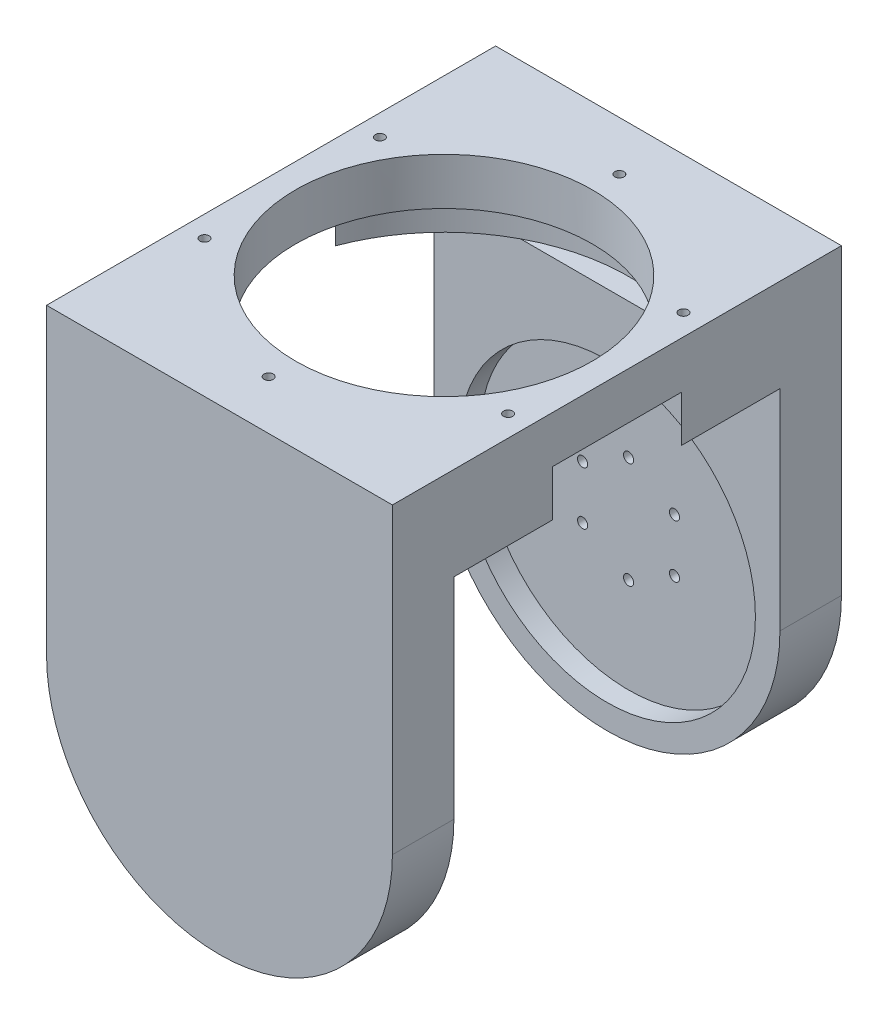
ISO-10303-21;
HEADER;
FILE_DESCRIPTION(('STEP AP214'),'2;1');
FILE_NAME('part.step','',(''),(''),'','','');
FILE_SCHEMA(('AUTOMOTIVE_DESIGN { 1 0 10303 214 1 1 1 1 }'));
ENDSEC;
DATA;
#1=APPLICATION_CONTEXT('core data for automotive mechanical design processes');
#2=APPLICATION_PROTOCOL_DEFINITION('international standard','automotive_design',2000,#1);
#3=PRODUCT_CONTEXT('',#1,'mechanical');
#4=PRODUCT('Part','Part','',(#3));
#5=PRODUCT_RELATED_PRODUCT_CATEGORY('part','',(#4));
#6=PRODUCT_DEFINITION_FORMATION('','',#4);
#7=PRODUCT_DEFINITION_CONTEXT('part definition',#1,'design');
#8=PRODUCT_DEFINITION('design','',#6,#7);
#9=PRODUCT_DEFINITION_SHAPE('','',#8);
#10=(LENGTH_UNIT() NAMED_UNIT(*) SI_UNIT(.MILLI.,.METRE.));
#11=(NAMED_UNIT(*) PLANE_ANGLE_UNIT() SI_UNIT($,.RADIAN.));
#12=(NAMED_UNIT(*) SI_UNIT($,.STERADIAN.) SOLID_ANGLE_UNIT());
#13=UNCERTAINTY_MEASURE_WITH_UNIT(LENGTH_MEASURE(1.E-05),#10,'distance_accuracy_value','');
#14=(GEOMETRIC_REPRESENTATION_CONTEXT(3) GLOBAL_UNCERTAINTY_ASSIGNED_CONTEXT((#13)) GLOBAL_UNIT_ASSIGNED_CONTEXT((#10,
#11,#12)) REPRESENTATION_CONTEXT('',''));
#15=CARTESIAN_POINT('',(0.,0.,0.));
#16=DIRECTION('',(0.,0.,1.));
#17=DIRECTION('',(1.,0.,0.));
#18=AXIS2_PLACEMENT_3D('',#15,#16,#17);
#19=CARTESIAN_POINT('',(0.,16.7418138891637,53.));
#20=DIRECTION('',(0.,1.,0.));
#21=DIRECTION('',(0.,0.,1.));
#22=AXIS2_PLACEMENT_3D('',#19,#20,#21);
#23=CYLINDRICAL_SURFACE('',#22,48.25);
#24=CARTESIAN_POINT('',(0.,61.7418138891637,53.));
#25=DIRECTION('',(0.,1.,0.));
#26=DIRECTION('',(0.,0.,1.));
#27=AXIS2_PLACEMENT_3D('',#24,#25,#26);
#28=CIRCLE('',#27,48.25);
#29=CARTESIAN_POINT('',(0.,61.7418138891637,101.25));
#30=VERTEX_POINT('',#29);
#31=EDGE_CURVE('E200',#30,#30,#28,.F.);
#32=ORIENTED_EDGE('',*,*,#31,.F.);
#33=EDGE_LOOP('',(#32));
#34=FACE_BOUND('',#33,.T.);
#35=CARTESIAN_POINT('',(0.,46.493769150616,53.));
#36=DIRECTION('',(0.,-1.,0.));
#37=DIRECTION('',(0.,0.,-1.));
#38=AXIS2_PLACEMENT_3D('',#35,#36,#37);
#39=CIRCLE('',#38,48.25);
#40=CARTESIAN_POINT('',(0.,46.493769150616,4.75));
#41=VERTEX_POINT('',#40);
#42=EDGE_CURVE('E71',#41,#41,#39,.F.);
#43=ORIENTED_EDGE('',*,*,#42,.F.);
#44=EDGE_LOOP('',(#43));
#45=FACE_BOUND('',#44,.T.);
#46=ADVANCED_FACE('F67',(#34,#45),#23,.F.);
#47=CARTESIAN_POINT('',(56.2228913057406,31.493769150616,0.));
#48=DIRECTION('',(0.,1.,0.));
#49=DIRECTION('',(0.,0.,1.));
#50=AXIS2_PLACEMENT_3D('',#47,#48,#49);
#51=PLANE('',#50);
#52=DIRECTION('',(-1.,0.,0.));
#53=VECTOR('',#52,1.);
#54=CARTESIAN_POINT('',(56.2228913057406,31.493769150616,106.));
#55=LINE('',#54,#53);
#56=CARTESIAN_POINT('',(56.2228913057406,31.493769150616,106.));
#57=VERTEX_POINT('',#56);
#58=CARTESIAN_POINT('',(28.1247222208504,31.493769150616,106.));
#59=VERTEX_POINT('',#58);
#60=EDGE_CURVE('E241',#57,#59,#55,.T.);
#61=ORIENTED_EDGE('',*,*,#60,.T.);
#62=CARTESIAN_POINT('',(0.,31.493769150616,53.));
#63=DIRECTION('',(0.,1.,0.));
#64=DIRECTION('',(0.,0.,1.));
#65=AXIS2_PLACEMENT_3D('',#62,#63,#64);
#66=CIRCLE('',#65,60.);
#67=CARTESIAN_POINT('',(56.2228913057406,31.493769150616,73.9520045156275));
#68=VERTEX_POINT('',#67);
#69=EDGE_CURVE('E12',#59,#68,#66,.T.);
#70=ORIENTED_EDGE('',*,*,#69,.T.);
#71=DIRECTION('',(0.,0.,-1.));
#72=VECTOR('',#71,1.);
#73=CARTESIAN_POINT('',(56.2228913057406,31.493769150616,0.));
#74=LINE('',#73,#72);
#75=EDGE_CURVE('E225',#57,#68,#74,.T.);
#76=ORIENTED_EDGE('',*,*,#75,.F.);
#77=EDGE_LOOP('',(#61,#70,#76));
#78=FACE_BOUND('',#77,.T.);
#79=ADVANCED_FACE('F447',(#78),#51,.F.);
#80=CARTESIAN_POINT('',(56.2228913057406,31.493769150616,32.0479954843725));
#81=VERTEX_POINT('',#80);
#82=CARTESIAN_POINT('',(56.2228913057406,31.493769150616,0.));
#83=VERTEX_POINT('',#82);
#84=EDGE_CURVE('E229',#81,#83,#74,.T.);
#85=ORIENTED_EDGE('',*,*,#84,.F.);
#86=CARTESIAN_POINT('',(0.,31.493769150616,53.));
#87=DIRECTION('',(0.,-1.,0.));
#88=DIRECTION('',(0.,0.,-1.));
#89=AXIS2_PLACEMENT_3D('',#86,#87,#88);
#90=CIRCLE('',#89,60.);
#91=CARTESIAN_POINT('',(28.1247222208504,31.493769150616,0.));
#92=VERTEX_POINT('',#91);
#93=EDGE_CURVE('E179',#92,#81,#90,.T.);
#94=ORIENTED_EDGE('',*,*,#93,.F.);
#95=DIRECTION('',(-1.,0.,0.));
#96=VECTOR('',#95,1.);
#97=CARTESIAN_POINT('',(56.2228913057406,31.493769150616,0.));
#98=LINE('',#97,#96);
#99=EDGE_CURVE('E234',#83,#92,#98,.T.);
#100=ORIENTED_EDGE('',*,*,#99,.F.);
#101=EDGE_LOOP('',(#85,#94,#100));
#102=FACE_BOUND('',#101,.T.);
#103=ADVANCED_FACE('F403',(#102),#51,.F.);
#104=CARTESIAN_POINT('',(-28.1247222208505,31.493769150616,0.));
#105=VERTEX_POINT('',#104);
#106=CARTESIAN_POINT('',(-56.2228913057406,31.493769150616,0.));
#107=VERTEX_POINT('',#106);
#108=EDGE_CURVE('E240',#105,#107,#98,.T.);
#109=ORIENTED_EDGE('',*,*,#108,.F.);
#110=CARTESIAN_POINT('',(-56.2228913057406,31.493769150616,32.0479954843724));
#111=VERTEX_POINT('',#110);
#112=EDGE_CURVE('E77',#105,#111,#66,.T.);
#113=ORIENTED_EDGE('',*,*,#112,.T.);
#114=DIRECTION('',(0.,0.,-1.));
#115=VECTOR('',#114,1.);
#116=CARTESIAN_POINT('',(-56.2228913057406,31.493769150616,0.));
#117=LINE('',#116,#115);
#118=EDGE_CURVE('E224',#111,#107,#117,.T.);
#119=ORIENTED_EDGE('',*,*,#118,.T.);
#120=EDGE_LOOP('',(#109,#113,#119));
#121=FACE_BOUND('',#120,.T.);
#122=ADVANCED_FACE('F380',(#121),#51,.F.);
#123=CARTESIAN_POINT('',(-14.9389382152826,-45.3668138891632,126.001));
#124=DIRECTION('',(0.,0.,-1.));
#125=DIRECTION('',(-1.,0.,0.));
#126=AXIS2_PLACEMENT_3D('',#123,#124,#125);
#127=CYLINDRICAL_SURFACE('',#126,1.64999999999999);
#128=CARTESIAN_POINT('',(-14.9389382152826,-45.3668138891632,-20.));
#129=DIRECTION('',(0.,0.,-1.));
#130=DIRECTION('',(-1.,0.,0.));
#131=AXIS2_PLACEMENT_3D('',#128,#129,#130);
#132=CIRCLE('',#131,1.64999999999999);
#133=CARTESIAN_POINT('',(-16.5889382152826,-45.3668138891632,-20.));
#134=VERTEX_POINT('',#133);
#135=EDGE_CURVE('E279',#134,#134,#132,.F.);
#136=ORIENTED_EDGE('',*,*,#135,.F.);
#137=EDGE_LOOP('',(#136));
#138=FACE_BOUND('',#137,.T.);
#139=CARTESIAN_POINT('',(-14.9389382152826,-45.3668138891632,-7.00000000000001));
#140=DIRECTION('',(0.,0.,1.));
#141=DIRECTION('',(1.,0.,0.));
#142=AXIS2_PLACEMENT_3D('',#139,#140,#141);
#143=CIRCLE('',#142,1.64999999999999);
#144=CARTESIAN_POINT('',(-13.2889382152826,-45.3668138891632,-7.00000000000001));
#145=VERTEX_POINT('',#144);
#146=EDGE_CURVE('E270',#145,#145,#143,.T.);
#147=ORIENTED_EDGE('',*,*,#146,.T.);
#148=EDGE_LOOP('',(#147));
#149=FACE_BOUND('',#148,.T.);
#150=ADVANCED_FACE('F694',(#138,#149),#127,.F.);
#151=CARTESIAN_POINT('',(-1.34079374929402E-12,-53.9918138891637,126.001));
#152=DIRECTION('',(0.,0.,-1.));
#153=DIRECTION('',(-1.,0.,0.));
#154=AXIS2_PLACEMENT_3D('',#151,#152,#153);
#155=CYLINDRICAL_SURFACE('',#154,1.65);
#156=CARTESIAN_POINT('',(-1.34079374929402E-12,-53.9918138891637,-20.));
#157=DIRECTION('',(0.,0.,-1.));
#158=DIRECTION('',(-1.,0.,0.));
#159=AXIS2_PLACEMENT_3D('',#156,#157,#158);
#160=CIRCLE('',#159,1.65);
#161=CARTESIAN_POINT('',(-1.65000000000134,-53.9918138891637,-20.));
#162=VERTEX_POINT('',#161);
#163=EDGE_CURVE('E275',#162,#162,#160,.F.);
#164=ORIENTED_EDGE('',*,*,#163,.F.);
#165=EDGE_LOOP('',(#164));
#166=FACE_BOUND('',#165,.T.);
#167=CARTESIAN_POINT('',(-1.34079374929402E-12,-53.9918138891637,-7.00000000000001));
#168=DIRECTION('',(0.,0.,1.));
#169=DIRECTION('',(1.,0.,0.));
#170=AXIS2_PLACEMENT_3D('',#167,#168,#169);
#171=CIRCLE('',#170,1.65);
#172=CARTESIAN_POINT('',(1.64999999999866,-53.9918138891637,-7.00000000000001));
#173=VERTEX_POINT('',#172);
#174=EDGE_CURVE('E266',#173,#173,#171,.T.);
#175=ORIENTED_EDGE('',*,*,#174,.T.);
#176=EDGE_LOOP('',(#175));
#177=FACE_BOUND('',#176,.T.);
#178=ADVANCED_FACE('F690',(#166,#177),#155,.F.);
#179=CARTESIAN_POINT('',(14.9389382152805,-45.3668138891642,126.001));
#180=DIRECTION('',(0.,0.,-1.));
#181=DIRECTION('',(-1.,0.,0.));
#182=AXIS2_PLACEMENT_3D('',#179,#180,#181);
#183=CYLINDRICAL_SURFACE('',#182,1.65);
#184=CARTESIAN_POINT('',(14.9389382152805,-45.3668138891642,-20.));
#185=DIRECTION('',(0.,0.,-1.));
#186=DIRECTION('',(-1.,0.,0.));
#187=AXIS2_PLACEMENT_3D('',#184,#185,#186);
#188=CIRCLE('',#187,1.65);
#189=CARTESIAN_POINT('',(13.2889382152806,-45.3668138891642,-20.));
#190=VERTEX_POINT('',#189);
#191=EDGE_CURVE('E280',#190,#190,#188,.F.);
#192=ORIENTED_EDGE('',*,*,#191,.F.);
#193=EDGE_LOOP('',(#192));
#194=FACE_BOUND('',#193,.T.);
#195=CARTESIAN_POINT('',(14.9389382152805,-45.3668138891642,-7.00000000000001));
#196=DIRECTION('',(0.,0.,1.));
#197=DIRECTION('',(1.,0.,0.));
#198=AXIS2_PLACEMENT_3D('',#195,#196,#197);
#199=CIRCLE('',#198,1.65);
#200=CARTESIAN_POINT('',(16.5889382152805,-45.3668138891642,-7.00000000000001));
#201=VERTEX_POINT('',#200);
#202=EDGE_CURVE('E262',#201,#201,#199,.T.);
#203=ORIENTED_EDGE('',*,*,#202,.T.);
#204=EDGE_LOOP('',(#203));
#205=FACE_BOUND('',#204,.T.);
#206=ADVANCED_FACE('F693',(#194,#205),#183,.F.);
#207=CARTESIAN_POINT('',(14.9389382152811,-28.1168138891642,126.001));
#208=DIRECTION('',(0.,0.,-1.));
#209=DIRECTION('',(-1.,0.,0.));
#210=AXIS2_PLACEMENT_3D('',#207,#208,#209);
#211=CYLINDRICAL_SURFACE('',#210,1.65);
#212=CARTESIAN_POINT('',(14.9389382152811,-28.1168138891642,-20.));
#213=DIRECTION('',(0.,0.,-1.));
#214=DIRECTION('',(-1.,0.,0.));
#215=AXIS2_PLACEMENT_3D('',#212,#213,#214);
#216=CIRCLE('',#215,1.65);
#217=CARTESIAN_POINT('',(13.2889382152811,-28.1168138891642,-20.));
#218=VERTEX_POINT('',#217);
#219=EDGE_CURVE('E284',#218,#218,#216,.F.);
#220=ORIENTED_EDGE('',*,*,#219,.F.);
#221=EDGE_LOOP('',(#220));
#222=FACE_BOUND('',#221,.T.);
#223=CARTESIAN_POINT('',(14.9389382152811,-28.1168138891642,-7.00000000000001));
#224=DIRECTION('',(0.,0.,1.));
#225=DIRECTION('',(1.,0.,0.));
#226=AXIS2_PLACEMENT_3D('',#223,#224,#225);
#227=CIRCLE('',#226,1.65);
#228=CARTESIAN_POINT('',(16.5889382152811,-28.1168138891642,-7.00000000000001));
#229=VERTEX_POINT('',#228);
#230=EDGE_CURVE('E258',#229,#229,#227,.T.);
#231=ORIENTED_EDGE('',*,*,#230,.T.);
#232=EDGE_LOOP('',(#231));
#233=FACE_BOUND('',#232,.T.);
#234=ADVANCED_FACE('F698',(#222,#233),#211,.F.);
#235=CARTESIAN_POINT('',(0.,-19.4918138891637,126.001));
#236=DIRECTION('',(0.,0.,-1.));
#237=DIRECTION('',(-1.,0.,0.));
#238=AXIS2_PLACEMENT_3D('',#235,#236,#237);
#239=CYLINDRICAL_SURFACE('',#238,1.65);
#240=CARTESIAN_POINT('',(0.,-19.4918138891637,-20.));
#241=DIRECTION('',(0.,0.,-1.));
#242=DIRECTION('',(-1.,0.,0.));
#243=AXIS2_PLACEMENT_3D('',#240,#241,#242);
#244=CIRCLE('',#243,1.65);
#245=CARTESIAN_POINT('',(-1.65,-19.4918138891637,-20.));
#246=VERTEX_POINT('',#245);
#247=EDGE_CURVE('E288',#246,#246,#244,.F.);
#248=ORIENTED_EDGE('',*,*,#247,.F.);
#249=EDGE_LOOP('',(#248));
#250=FACE_BOUND('',#249,.T.);
#251=CARTESIAN_POINT('',(0.,-19.4918138891637,-7.00000000000001));
#252=DIRECTION('',(0.,0.,1.));
#253=DIRECTION('',(1.,0.,0.));
#254=AXIS2_PLACEMENT_3D('',#251,#252,#253);
#255=CIRCLE('',#254,1.65);
#256=CARTESIAN_POINT('',(1.65,-19.4918138891637,-7.00000000000001));
#257=VERTEX_POINT('',#256);
#258=EDGE_CURVE('E254',#257,#257,#255,.T.);
#259=ORIENTED_EDGE('',*,*,#258,.T.);
#260=EDGE_LOOP('',(#259));
#261=FACE_BOUND('',#260,.T.);
#262=ADVANCED_FACE('F702',(#250,#261),#239,.F.);
#263=CARTESIAN_POINT('',(-14.938938215282,-28.1168138891631,126.001));
#264=DIRECTION('',(0.,0.,-1.));
#265=DIRECTION('',(-1.,0.,0.));
#266=AXIS2_PLACEMENT_3D('',#263,#264,#265);
#267=CYLINDRICAL_SURFACE('',#266,1.65);
#268=CARTESIAN_POINT('',(-14.938938215282,-28.1168138891631,-20.));
#269=DIRECTION('',(0.,0.,-1.));
#270=DIRECTION('',(-1.,0.,0.));
#271=AXIS2_PLACEMENT_3D('',#268,#269,#270);
#272=CIRCLE('',#271,1.65);
#273=CARTESIAN_POINT('',(-16.588938215282,-28.1168138891631,-20.));
#274=VERTEX_POINT('',#273);
#275=EDGE_CURVE('E274',#274,#274,#272,.F.);
#276=ORIENTED_EDGE('',*,*,#275,.F.);
#277=EDGE_LOOP('',(#276));
#278=FACE_BOUND('',#277,.T.);
#279=CARTESIAN_POINT('',(-14.938938215282,-28.1168138891631,-7.00000000000001));
#280=DIRECTION('',(0.,0.,1.));
#281=DIRECTION('',(1.,0.,0.));
#282=AXIS2_PLACEMENT_3D('',#279,#280,#281);
#283=CIRCLE('',#282,1.65);
#284=CARTESIAN_POINT('',(-13.288938215282,-28.1168138891631,-7.00000000000001));
#285=VERTEX_POINT('',#284);
#286=EDGE_CURVE('E250',#285,#285,#283,.T.);
#287=ORIENTED_EDGE('',*,*,#286,.T.);
#288=EDGE_LOOP('',(#287));
#289=FACE_BOUND('',#288,.T.);
#290=ADVANCED_FACE('F706',(#278,#289),#267,.F.);
#291=CARTESIAN_POINT('',(0.,-36.7418138891637,20.));
#292=DIRECTION('',(0.,0.,-1.));
#293=DIRECTION('',(-1.,0.,0.));
#294=AXIS2_PLACEMENT_3D('',#291,#292,#293);
#295=CYLINDRICAL_SURFACE('',#294,56.2228913057406);
#296=CARTESIAN_POINT('',(0.,-36.7418138891637,0.));
#297=DIRECTION('',(0.,0.,1.));
#298=DIRECTION('',(1.,0.,0.));
#299=AXIS2_PLACEMENT_3D('',#296,#297,#298);
#300=CIRCLE('',#299,56.2228913057406);
#301=CARTESIAN_POINT('',(-56.2228913057406,-36.7418138891637,0.));
#302=VERTEX_POINT('',#301);
#303=CARTESIAN_POINT('',(56.2228913057406,-36.7418138891637,0.));
#304=VERTEX_POINT('',#303);
#305=EDGE_CURVE('E313',#302,#304,#300,.T.);
#306=ORIENTED_EDGE('',*,*,#305,.F.);
#307=DIRECTION('',(0.,0.,-1.));
#308=VECTOR('',#307,1.);
#309=CARTESIAN_POINT('',(-56.2228913057406,-36.7418138891637,20.));
#310=LINE('',#309,#308);
#311=CARTESIAN_POINT('',(-56.2228913057406,-36.7418138891637,-20.));
#312=VERTEX_POINT('',#311);
#313=EDGE_CURVE('E357',#302,#312,#310,.T.);
#314=ORIENTED_EDGE('',*,*,#313,.T.);
#315=CARTESIAN_POINT('',(0.,-36.7418138891637,-20.));
#316=DIRECTION('',(0.,0.,-1.));
#317=DIRECTION('',(-1.,0.,0.));
#318=AXIS2_PLACEMENT_3D('',#315,#316,#317);
#319=CIRCLE('',#318,56.2228913057406);
#320=CARTESIAN_POINT('',(56.2228913057406,-36.7418138891637,-20.));
#321=VERTEX_POINT('',#320);
#322=EDGE_CURVE('E320',#321,#312,#319,.T.);
#323=ORIENTED_EDGE('',*,*,#322,.F.);
#324=DIRECTION('',(0.,0.,-1.));
#325=VECTOR('',#324,1.);
#326=CARTESIAN_POINT('',(56.2228913057406,-36.7418138891637,20.));
#327=LINE('',#326,#325);
#328=EDGE_CURVE('E360',#304,#321,#327,.T.);
#329=ORIENTED_EDGE('',*,*,#328,.F.);
#330=EDGE_LOOP('',(#306,#314,#323,#329));
#331=FACE_BOUND('',#330,.T.);
#332=ADVANCED_FACE('F69',(#331),#295,.T.);
#333=CARTESIAN_POINT('',(0.,-36.7418138891637,106.));
#334=DIRECTION('',(0.,0.,-1.));
#335=DIRECTION('',(-1.,0.,0.));
#336=AXIS2_PLACEMENT_3D('',#333,#334,#335);
#337=CYLINDRICAL_SURFACE('',#336,56.2228913057406);
#338=CARTESIAN_POINT('',(0.,-36.7418138891637,106.));
#339=DIRECTION('',(0.,0.,-1.));
#340=DIRECTION('',(-1.,0.,0.));
#341=AXIS2_PLACEMENT_3D('',#338,#339,#340);
#342=CIRCLE('',#341,56.2228913057406);
#343=CARTESIAN_POINT('',(56.2228913057406,-36.7418138891637,106.));
#344=VERTEX_POINT('',#343);
#345=CARTESIAN_POINT('',(-56.2228913057406,-36.7418138891637,106.));
#346=VERTEX_POINT('',#345);
#347=EDGE_CURVE('E334',#344,#346,#342,.T.);
#348=ORIENTED_EDGE('',*,*,#347,.F.);
#349=DIRECTION('',(0.,0.,-1.));
#350=VECTOR('',#349,1.);
#351=CARTESIAN_POINT('',(56.2228913057406,-36.7418138891637,106.));
#352=LINE('',#351,#350);
#353=CARTESIAN_POINT('',(56.2228913057406,-36.7418138891637,126.));
#354=VERTEX_POINT('',#353);
#355=EDGE_CURVE('E353',#354,#344,#352,.T.);
#356=ORIENTED_EDGE('',*,*,#355,.F.);
#357=CARTESIAN_POINT('',(0.,-36.7418138891637,126.));
#358=DIRECTION('',(0.,0.,1.));
#359=DIRECTION('',(1.,0.,0.));
#360=AXIS2_PLACEMENT_3D('',#357,#358,#359);
#361=CIRCLE('',#360,56.2228913057406);
#362=CARTESIAN_POINT('',(-56.2228913057406,-36.7418138891637,126.));
#363=VERTEX_POINT('',#362);
#364=EDGE_CURVE('E341',#363,#354,#361,.T.);
#365=ORIENTED_EDGE('',*,*,#364,.F.);
#366=DIRECTION('',(0.,0.,-1.));
#367=VECTOR('',#366,1.);
#368=CARTESIAN_POINT('',(-56.2228913057406,-36.7418138891637,106.));
#369=LINE('',#368,#367);
#370=EDGE_CURVE('E93',#363,#346,#369,.T.);
#371=ORIENTED_EDGE('',*,*,#370,.T.);
#372=EDGE_LOOP('',(#348,#356,#365,#371));
#373=FACE_BOUND('',#372,.T.);
#374=ADVANCED_FACE('F427',(#373),#337,.T.);
#375=CARTESIAN_POINT('',(56.2228913057406,0.,20.));
#376=DIRECTION('',(-1.,0.,0.));
#377=DIRECTION('',(0.,0.,1.));
#378=AXIS2_PLACEMENT_3D('',#375,#376,#377);
#379=PLANE('',#378);
#380=DIRECTION('',(0.,0.,1.));
#381=VECTOR('',#380,1.);
#382=CARTESIAN_POINT('',(56.2228913057406,46.493769150616,20.));
#383=LINE('',#382,#381);
#384=CARTESIAN_POINT('',(56.2228913057406,46.493769150616,32.0479954843725));
#385=VERTEX_POINT('',#384);
#386=CARTESIAN_POINT('',(56.2228913057406,46.493769150616,73.9520045156275));
#387=VERTEX_POINT('',#386);
#388=EDGE_CURVE('E189',#385,#387,#383,.T.);
#389=ORIENTED_EDGE('',*,*,#388,.F.);
#390=DIRECTION('',(0.,-1.,0.));
#391=VECTOR('',#390,1.);
#392=CARTESIAN_POINT('',(56.2228913057406,46.493769150616,32.0479954843725));
#393=LINE('',#392,#391);
#394=EDGE_CURVE('E172',#385,#81,#393,.T.);
#395=ORIENTED_EDGE('',*,*,#394,.T.);
#396=ORIENTED_EDGE('',*,*,#84,.T.);
#397=DIRECTION('',(0.,1.,0.));
#398=VECTOR('',#397,1.);
#399=CARTESIAN_POINT('',(56.2228913057406,-36.7418138891637,0.));
#400=LINE('',#399,#398);
#401=EDGE_CURVE('E316',#304,#83,#400,.T.);
#402=ORIENTED_EDGE('',*,*,#401,.F.);
#403=ORIENTED_EDGE('',*,*,#328,.T.);
#404=DIRECTION('',(0.,-1.,0.));
#405=VECTOR('',#404,1.);
#406=CARTESIAN_POINT('',(56.2228913057406,36.7418138891637,-20.));
#407=LINE('',#406,#405);
#408=CARTESIAN_POINT('',(56.2228913057406,61.7418138891637,-20.));
#409=VERTEX_POINT('',#408);
#410=EDGE_CURVE('E327',#409,#321,#407,.T.);
#411=ORIENTED_EDGE('',*,*,#410,.F.);
#412=DIRECTION('',(0.,0.,-1.));
#413=VECTOR('',#412,1.);
#414=CARTESIAN_POINT('',(56.2228913057406,61.7418138891637,126.));
#415=LINE('',#414,#413);
#416=CARTESIAN_POINT('',(56.2228913057406,61.7418138891637,126.));
#417=VERTEX_POINT('',#416);
#418=EDGE_CURVE('E212',#417,#409,#415,.T.);
#419=ORIENTED_EDGE('',*,*,#418,.F.);
#420=DIRECTION('',(0.,1.,0.));
#421=VECTOR('',#420,1.);
#422=CARTESIAN_POINT('',(56.2228913057406,-36.7418138891637,126.));
#423=LINE('',#422,#421);
#424=EDGE_CURVE('E345',#354,#417,#423,.T.);
#425=ORIENTED_EDGE('',*,*,#424,.F.);
#426=ORIENTED_EDGE('',*,*,#355,.T.);
#427=DIRECTION('',(0.,-1.,0.));
#428=VECTOR('',#427,1.);
#429=CARTESIAN_POINT('',(56.2228913057406,6.49376915061593,106.));
#430=LINE('',#429,#428);
#431=EDGE_CURVE('E331',#57,#344,#430,.T.);
#432=ORIENTED_EDGE('',*,*,#431,.F.);
#433=ORIENTED_EDGE('',*,*,#75,.T.);
#434=DIRECTION('',(0.,-1.,0.));
#435=VECTOR('',#434,1.);
#436=CARTESIAN_POINT('',(56.2228913057406,46.493769150616,73.9520045156275));
#437=LINE('',#436,#435);
#438=EDGE_CURVE('E184',#68,#387,#437,.F.);
#439=ORIENTED_EDGE('',*,*,#438,.T.);
#440=EDGE_LOOP('',(#389,#395,#396,#402,#403,#411,#419,#425,#426,#432,#433,#439));
#441=FACE_BOUND('',#440,.T.);
#442=ADVANCED_FACE('F197',(#441),#379,.F.);
#443=CARTESIAN_POINT('',(-56.2228913057406,0.,20.));
#444=DIRECTION('',(-1.,0.,0.));
#445=DIRECTION('',(0.,0.,1.));
#446=AXIS2_PLACEMENT_3D('',#443,#444,#445);
#447=PLANE('',#446);
#448=DIRECTION('',(0.,-1.,0.));
#449=VECTOR('',#448,1.);
#450=CARTESIAN_POINT('',(-56.2228913057406,46.493769150616,32.0479954843724));
#451=LINE('',#450,#449);
#452=CARTESIAN_POINT('',(-56.2228913057406,46.493769150616,32.0479954843724));
#453=VERTEX_POINT('',#452);
#454=EDGE_CURVE('E384',#453,#111,#451,.T.);
#455=ORIENTED_EDGE('',*,*,#454,.F.);
#456=DIRECTION('',(0.,0.,1.));
#457=VECTOR('',#456,1.);
#458=CARTESIAN_POINT('',(-56.2228913057406,46.493769150616,20.));
#459=LINE('',#458,#457);
#460=CARTESIAN_POINT('',(-56.2228913057406,46.493769150616,73.9520045156276));
#461=VERTEX_POINT('',#460);
#462=EDGE_CURVE('E192',#453,#461,#459,.T.);
#463=ORIENTED_EDGE('',*,*,#462,.T.);
#464=DIRECTION('',(0.,-1.,0.));
#465=VECTOR('',#464,1.);
#466=CARTESIAN_POINT('',(-56.2228913057406,46.493769150616,73.9520045156276));
#467=LINE('',#466,#465);
#468=CARTESIAN_POINT('',(-56.2228913057406,31.493769150616,73.9520045156276));
#469=VERTEX_POINT('',#468);
#470=EDGE_CURVE('E408',#469,#461,#467,.F.);
#471=ORIENTED_EDGE('',*,*,#470,.F.);
#472=CARTESIAN_POINT('',(-56.2228913057406,31.493769150616,106.));
#473=VERTEX_POINT('',#472);
#474=EDGE_CURVE('E230',#473,#469,#117,.T.);
#475=ORIENTED_EDGE('',*,*,#474,.F.);
#476=DIRECTION('',(0.,1.,0.));
#477=VECTOR('',#476,1.);
#478=CARTESIAN_POINT('',(-56.2228913057406,-36.7418138891637,106.));
#479=LINE('',#478,#477);
#480=EDGE_CURVE('E337',#346,#473,#479,.T.);
#481=ORIENTED_EDGE('',*,*,#480,.F.);
#482=ORIENTED_EDGE('',*,*,#370,.F.);
#483=DIRECTION('',(0.,-1.,0.));
#484=VECTOR('',#483,1.);
#485=CARTESIAN_POINT('',(-56.2228913057406,36.7418138891637,126.));
#486=LINE('',#485,#484);
#487=CARTESIAN_POINT('',(-56.2228913057406,61.7418138891637,126.));
#488=VERTEX_POINT('',#487);
#489=EDGE_CURVE('E348',#488,#363,#486,.T.);
#490=ORIENTED_EDGE('',*,*,#489,.F.);
#491=DIRECTION('',(0.,0.,1.));
#492=VECTOR('',#491,1.);
#493=CARTESIAN_POINT('',(-56.2228913057406,61.7418138891637,-20.));
#494=LINE('',#493,#492);
#495=CARTESIAN_POINT('',(-56.2228913057406,61.7418138891637,-20.));
#496=VERTEX_POINT('',#495);
#497=EDGE_CURVE('E220',#496,#488,#494,.T.);
#498=ORIENTED_EDGE('',*,*,#497,.F.);
#499=DIRECTION('',(0.,1.,0.));
#500=VECTOR('',#499,1.);
#501=CARTESIAN_POINT('',(-56.2228913057406,-36.7418138891637,-20.));
#502=LINE('',#501,#500);
#503=EDGE_CURVE('E324',#312,#496,#502,.T.);
#504=ORIENTED_EDGE('',*,*,#503,.F.);
#505=ORIENTED_EDGE('',*,*,#313,.F.);
#506=DIRECTION('',(0.,-1.,0.));
#507=VECTOR('',#506,1.);
#508=CARTESIAN_POINT('',(-56.2228913057406,6.49376915061594,0.));
#509=LINE('',#508,#507);
#510=EDGE_CURVE('E307',#107,#302,#509,.T.);
#511=ORIENTED_EDGE('',*,*,#510,.F.);
#512=ORIENTED_EDGE('',*,*,#118,.F.);
#513=EDGE_LOOP('',(#455,#463,#471,#475,#481,#482,#490,#498,#504,#505,#511,#512));
#514=FACE_BOUND('',#513,.T.);
#515=ADVANCED_FACE('F383',(#514),#447,.T.);
#516=CARTESIAN_POINT('',(0.,-36.7418138891637,126.));
#517=DIRECTION('',(0.,0.,1.));
#518=DIRECTION('',(1.,0.,0.));
#519=AXIS2_PLACEMENT_3D('',#516,#517,#518);
#520=PLANE('',#519);
#521=ORIENTED_EDGE('',*,*,#364,.T.);
#522=ORIENTED_EDGE('',*,*,#424,.T.);
#523=DIRECTION('',(1.,0.,0.));
#524=VECTOR('',#523,1.);
#525=CARTESIAN_POINT('',(-56.2228913057406,61.7418138891637,126.));
#526=LINE('',#525,#524);
#527=EDGE_CURVE('E205',#488,#417,#526,.T.);
#528=ORIENTED_EDGE('',*,*,#527,.F.);
#529=ORIENTED_EDGE('',*,*,#489,.T.);
#530=EDGE_LOOP('',(#521,#522,#528,#529));
#531=FACE_BOUND('',#530,.T.);
#532=ADVANCED_FACE('F430',(#531),#520,.T.);
#533=CARTESIAN_POINT('',(0.,-36.7418138891637,106.));
#534=DIRECTION('',(0.,0.,-1.));
#535=DIRECTION('',(-1.,0.,0.));
#536=AXIS2_PLACEMENT_3D('',#533,#534,#535);
#537=PLANE('',#536);
#538=ORIENTED_EDGE('',*,*,#60,.F.);
#539=ORIENTED_EDGE('',*,*,#431,.T.);
#540=ORIENTED_EDGE('',*,*,#347,.T.);
#541=ORIENTED_EDGE('',*,*,#480,.T.);
#542=CARTESIAN_POINT('',(-28.1247222208505,31.493769150616,106.));
#543=VERTEX_POINT('',#542);
#544=EDGE_CURVE('E228',#543,#473,#55,.T.);
#545=ORIENTED_EDGE('',*,*,#544,.F.);
#546=EDGE_CURVE('E245',#59,#543,#55,.T.);
#547=ORIENTED_EDGE('',*,*,#546,.F.);
#548=EDGE_LOOP('',(#538,#539,#540,#541,#545,#547));
#549=FACE_BOUND('',#548,.T.);
#550=CARTESIAN_POINT('',(0.,-36.7418138891637,106.));
#551=DIRECTION('',(0.,0.,-1.));
#552=DIRECTION('',(-1.,0.,0.));
#553=AXIS2_PLACEMENT_3D('',#550,#551,#552);
#554=CIRCLE('',#553,27.5);
#555=CARTESIAN_POINT('',(-27.5,-36.7418138891637,106.));
#556=VERTEX_POINT('',#555);
#557=EDGE_CURVE('E302',#556,#556,#554,.T.);
#558=ORIENTED_EDGE('',*,*,#557,.F.);
#559=EDGE_LOOP('',(#558));
#560=FACE_BOUND('',#559,.T.);
#561=ADVANCED_FACE('F422',(#549,#560),#537,.T.);
#562=CARTESIAN_POINT('',(0.,-36.7418138891637,-20.));
#563=DIRECTION('',(0.,0.,-1.));
#564=DIRECTION('',(-1.,0.,0.));
#565=AXIS2_PLACEMENT_3D('',#562,#563,#564);
#566=PLANE('',#565);
#567=ORIENTED_EDGE('',*,*,#275,.T.);
#568=EDGE_LOOP('',(#567));
#569=FACE_BOUND('',#568,.T.);
#570=ORIENTED_EDGE('',*,*,#247,.T.);
#571=EDGE_LOOP('',(#570));
#572=FACE_BOUND('',#571,.T.);
#573=ORIENTED_EDGE('',*,*,#219,.T.);
#574=EDGE_LOOP('',(#573));
#575=FACE_BOUND('',#574,.T.);
#576=ORIENTED_EDGE('',*,*,#191,.T.);
#577=EDGE_LOOP('',(#576));
#578=FACE_BOUND('',#577,.T.);
#579=ORIENTED_EDGE('',*,*,#163,.T.);
#580=EDGE_LOOP('',(#579));
#581=FACE_BOUND('',#580,.T.);
#582=ORIENTED_EDGE('',*,*,#135,.T.);
#583=EDGE_LOOP('',(#582));
#584=FACE_BOUND('',#583,.T.);
#585=ORIENTED_EDGE('',*,*,#322,.T.);
#586=ORIENTED_EDGE('',*,*,#503,.T.);
#587=DIRECTION('',(-1.,0.,0.));
#588=VECTOR('',#587,1.);
#589=CARTESIAN_POINT('',(56.2228913057406,61.7418138891637,-20.));
#590=LINE('',#589,#588);
#591=EDGE_CURVE('E216',#409,#496,#590,.T.);
#592=ORIENTED_EDGE('',*,*,#591,.F.);
#593=ORIENTED_EDGE('',*,*,#410,.T.);
#594=EDGE_LOOP('',(#585,#586,#592,#593));
#595=FACE_BOUND('',#594,.T.);
#596=ADVANCED_FACE('F439',(#569,#572,#575,#578,#581,#584,#595),#566,.T.);
#597=CARTESIAN_POINT('',(0.,-36.7418138891637,0.));
#598=DIRECTION('',(0.,0.,1.));
#599=DIRECTION('',(1.,0.,0.));
#600=AXIS2_PLACEMENT_3D('',#597,#598,#599);
#601=PLANE('',#600);
#602=ORIENTED_EDGE('',*,*,#99,.T.);
#603=EDGE_CURVE('E239',#92,#105,#98,.T.);
#604=ORIENTED_EDGE('',*,*,#603,.T.);
#605=ORIENTED_EDGE('',*,*,#108,.T.);
#606=ORIENTED_EDGE('',*,*,#510,.T.);
#607=ORIENTED_EDGE('',*,*,#305,.T.);
#608=ORIENTED_EDGE('',*,*,#401,.T.);
#609=EDGE_LOOP('',(#602,#604,#605,#606,#607,#608));
#610=FACE_BOUND('',#609,.T.);
#611=CARTESIAN_POINT('',(0.,-36.7418138891637,0.));
#612=DIRECTION('',(0.,0.,1.));
#613=DIRECTION('',(1.,0.,0.));
#614=AXIS2_PLACEMENT_3D('',#611,#612,#613);
#615=CIRCLE('',#614,48.25);
#616=CARTESIAN_POINT('',(48.25,-36.7418138891637,0.));
#617=VERTEX_POINT('',#616);
#618=EDGE_CURVE('E238',#617,#617,#615,.T.);
#619=ORIENTED_EDGE('',*,*,#618,.F.);
#620=EDGE_LOOP('',(#619));
#621=FACE_BOUND('',#620,.T.);
#622=ADVANCED_FACE('F393',(#610,#621),#601,.T.);
#623=CARTESIAN_POINT('',(0.,-36.7418138891637,86.));
#624=DIRECTION('',(0.,0.,-1.));
#625=DIRECTION('',(-1.,0.,0.));
#626=AXIS2_PLACEMENT_3D('',#623,#624,#625);
#627=PLANE('',#626);
#628=CARTESIAN_POINT('',(0.,-36.7418138891637,86.));
#629=DIRECTION('',(0.,0.,-1.));
#630=DIRECTION('',(-1.,0.,0.));
#631=AXIS2_PLACEMENT_3D('',#628,#629,#630);
#632=CIRCLE('',#631,27.5);
#633=CARTESIAN_POINT('',(-27.5,-36.7418138891637,86.));
#634=VERTEX_POINT('',#633);
#635=EDGE_CURVE('E303',#634,#634,#632,.T.);
#636=ORIENTED_EDGE('',*,*,#635,.T.);
#637=EDGE_LOOP('',(#636));
#638=FACE_BOUND('',#637,.T.);
#639=CARTESIAN_POINT('',(0.,-36.7418138891637,86.));
#640=DIRECTION('',(0.,0.,-1.));
#641=DIRECTION('',(-1.,0.,0.));
#642=AXIS2_PLACEMENT_3D('',#639,#640,#641);
#643=CIRCLE('',#642,13.1040746271291);
#644=CARTESIAN_POINT('',(-13.1040746271291,-36.7418138891637,86.));
#645=VERTEX_POINT('',#644);
#646=EDGE_CURVE('E298',#645,#645,#643,.T.);
#647=ORIENTED_EDGE('',*,*,#646,.F.);
#648=EDGE_LOOP('',(#647));
#649=FACE_BOUND('',#648,.T.);
#650=ADVANCED_FACE('F504',(#638,#649),#627,.T.);
#651=CARTESIAN_POINT('',(0.,-36.7418138891637,86.));
#652=DIRECTION('',(0.,0.,1.));
#653=DIRECTION('',(1.,0.,0.));
#654=AXIS2_PLACEMENT_3D('',#651,#652,#653);
#655=CYLINDRICAL_SURFACE('',#654,27.5);
#656=ORIENTED_EDGE('',*,*,#635,.F.);
#657=EDGE_LOOP('',(#656));
#658=FACE_BOUND('',#657,.T.);
#659=ORIENTED_EDGE('',*,*,#557,.T.);
#660=EDGE_LOOP('',(#659));
#661=FACE_BOUND('',#660,.T.);
#662=ADVANCED_FACE('F717',(#658,#661),#655,.T.);
#663=CARTESIAN_POINT('',(0.,-36.7418138891637,86.));
#664=DIRECTION('',(0.,0.,1.));
#665=DIRECTION('',(1.,0.,0.));
#666=AXIS2_PLACEMENT_3D('',#663,#664,#665);
#667=CYLINDRICAL_SURFACE('',#666,13.1040746271291);
#668=ORIENTED_EDGE('',*,*,#646,.T.);
#669=EDGE_LOOP('',(#668));
#670=FACE_BOUND('',#669,.T.);
#671=CARTESIAN_POINT('',(0.,-36.7418138891637,106.));
#672=DIRECTION('',(0.,0.,-1.));
#673=DIRECTION('',(-1.,0.,0.));
#674=AXIS2_PLACEMENT_3D('',#671,#672,#673);
#675=CIRCLE('',#674,13.1040746271291);
#676=CARTESIAN_POINT('',(-13.1040746271291,-36.7418138891637,106.));
#677=VERTEX_POINT('',#676);
#678=EDGE_CURVE('E363',#677,#677,#675,.F.);
#679=ORIENTED_EDGE('',*,*,#678,.T.);
#680=EDGE_LOOP('',(#679));
#681=FACE_BOUND('',#680,.T.);
#682=ADVANCED_FACE('F714',(#670,#681),#667,.F.);
#683=ORIENTED_EDGE('',*,*,#678,.F.);
#684=EDGE_LOOP('',(#683));
#685=FACE_BOUND('',#684,.T.);
#686=ADVANCED_FACE('F496',(#685),#537,.T.);
#687=CARTESIAN_POINT('',(0.,-36.7418138891637,-7.));
#688=DIRECTION('',(0.,0.,1.));
#689=DIRECTION('',(1.,0.,0.));
#690=AXIS2_PLACEMENT_3D('',#687,#688,#689);
#691=CYLINDRICAL_SURFACE('',#690,48.25);
#692=CARTESIAN_POINT('',(0.,-36.7418138891637,-7.));
#693=DIRECTION('',(0.,0.,1.));
#694=DIRECTION('',(1.,0.,0.));
#695=AXIS2_PLACEMENT_3D('',#692,#693,#694);
#696=CIRCLE('',#695,48.25);
#697=CARTESIAN_POINT('',(48.25,-36.7418138891637,-7.));
#698=VERTEX_POINT('',#697);
#699=EDGE_CURVE('E246',#698,#698,#696,.T.);
#700=ORIENTED_EDGE('',*,*,#699,.F.);
#701=EDGE_LOOP('',(#700));
#702=FACE_BOUND('',#701,.T.);
#703=ORIENTED_EDGE('',*,*,#618,.T.);
#704=EDGE_LOOP('',(#703));
#705=FACE_BOUND('',#704,.T.);
#706=ADVANCED_FACE('F685',(#702,#705),#691,.F.);
#707=CARTESIAN_POINT('',(0.,-36.7418138891637,-7.));
#708=DIRECTION('',(0.,0.,1.));
#709=DIRECTION('',(1.,0.,0.));
#710=AXIS2_PLACEMENT_3D('',#707,#708,#709);
#711=PLANE('',#710);
#712=ORIENTED_EDGE('',*,*,#146,.F.);
#713=EDGE_LOOP('',(#712));
#714=FACE_BOUND('',#713,.T.);
#715=ORIENTED_EDGE('',*,*,#174,.F.);
#716=EDGE_LOOP('',(#715));
#717=FACE_BOUND('',#716,.T.);
#718=ORIENTED_EDGE('',*,*,#202,.F.);
#719=EDGE_LOOP('',(#718));
#720=FACE_BOUND('',#719,.T.);
#721=ORIENTED_EDGE('',*,*,#230,.F.);
#722=EDGE_LOOP('',(#721));
#723=FACE_BOUND('',#722,.T.);
#724=ORIENTED_EDGE('',*,*,#258,.F.);
#725=EDGE_LOOP('',(#724));
#726=FACE_BOUND('',#725,.T.);
#727=ORIENTED_EDGE('',*,*,#286,.F.);
#728=EDGE_LOOP('',(#727));
#729=FACE_BOUND('',#728,.T.);
#730=ORIENTED_EDGE('',*,*,#699,.T.);
#731=EDGE_LOOP('',(#730));
#732=FACE_BOUND('',#731,.T.);
#733=ADVANCED_FACE('F510',(#714,#717,#720,#723,#726,#729,#732),#711,.T.);
#734=ORIENTED_EDGE('',*,*,#474,.T.);
#735=EDGE_CURVE('E78',#469,#543,#66,.T.);
#736=ORIENTED_EDGE('',*,*,#735,.T.);
#737=ORIENTED_EDGE('',*,*,#544,.T.);
#738=EDGE_LOOP('',(#734,#736,#737));
#739=FACE_BOUND('',#738,.T.);
#740=ADVANCED_FACE('F418',(#739),#51,.F.);
#741=CARTESIAN_POINT('',(0.,61.7418138891637,0.));
#742=DIRECTION('',(0.,1.,0.));
#743=DIRECTION('',(0.,0.,1.));
#744=AXIS2_PLACEMENT_3D('',#741,#742,#743);
#745=PLANE('',#744);
#746=CARTESIAN_POINT('',(0.,61.7418138891638,110.));
#747=DIRECTION('',(0.,-1.,0.));
#748=DIRECTION('',(0.,0.,-1.));
#749=AXIS2_PLACEMENT_3D('',#746,#747,#748);
#750=CIRCLE('',#749,1.5);
#751=CARTESIAN_POINT('',(0.,61.7418138891638,108.5));
#752=VERTEX_POINT('',#751);
#753=EDGE_CURVE('E400',#752,#752,#750,.T.);
#754=ORIENTED_EDGE('',*,*,#753,.T.);
#755=EDGE_LOOP('',(#754));
#756=FACE_BOUND('',#755,.T.);
#757=CARTESIAN_POINT('',(-49.3634480157115,61.7418138891638,81.4999999999985));
#758=DIRECTION('',(0.,-1.,0.));
#759=DIRECTION('',(0.,0.,-1.));
#760=AXIS2_PLACEMENT_3D('',#757,#758,#759);
#761=CIRCLE('',#760,1.50000000000001);
#762=CARTESIAN_POINT('',(-49.3634480157115,61.7418138891638,79.9999999999985));
#763=VERTEX_POINT('',#762);
#764=EDGE_CURVE('E640',#763,#763,#761,.T.);
#765=ORIENTED_EDGE('',*,*,#764,.T.);
#766=EDGE_LOOP('',(#765));
#767=FACE_BOUND('',#766,.T.);
#768=CARTESIAN_POINT('',(-49.3634480157097,61.7418138891638,24.4999999999984));
#769=DIRECTION('',(0.,-1.,0.));
#770=DIRECTION('',(0.,0.,-1.));
#771=AXIS2_PLACEMENT_3D('',#768,#769,#770);
#772=CIRCLE('',#771,1.5);
#773=CARTESIAN_POINT('',(-49.3634480157097,61.7418138891638,22.9999999999984));
#774=VERTEX_POINT('',#773);
#775=EDGE_CURVE('E656',#774,#774,#772,.T.);
#776=ORIENTED_EDGE('',*,*,#775,.T.);
#777=EDGE_LOOP('',(#776));
#778=FACE_BOUND('',#777,.T.);
#779=CARTESIAN_POINT('',(4.4202837051426E-12,61.7418138891638,-4.));
#780=DIRECTION('',(0.,-1.,0.));
#781=DIRECTION('',(0.,0.,-1.));
#782=AXIS2_PLACEMENT_3D('',#779,#780,#781);
#783=CIRCLE('',#782,1.5);
#784=CARTESIAN_POINT('',(4.4202837051426E-12,61.7418138891638,-5.5));
#785=VERTEX_POINT('',#784);
#786=EDGE_CURVE('E651',#785,#785,#783,.T.);
#787=ORIENTED_EDGE('',*,*,#786,.T.);
#788=EDGE_LOOP('',(#787));
#789=FACE_BOUND('',#788,.T.);
#790=CARTESIAN_POINT('',(49.3634480157165,61.7418138891638,24.5000000000019));
#791=DIRECTION('',(0.,-1.,0.));
#792=DIRECTION('',(0.,0.,-1.));
#793=AXIS2_PLACEMENT_3D('',#790,#791,#792);
#794=CIRCLE('',#793,1.5);
#795=CARTESIAN_POINT('',(49.3634480157165,61.7418138891638,23.0000000000019));
#796=VERTEX_POINT('',#795);
#797=EDGE_CURVE('E645',#796,#796,#794,.T.);
#798=ORIENTED_EDGE('',*,*,#797,.T.);
#799=EDGE_LOOP('',(#798));
#800=FACE_BOUND('',#799,.T.);
#801=CARTESIAN_POINT('',(49.3634480157143,61.7418138891638,81.500000000002));
#802=DIRECTION('',(0.,-1.,0.));
#803=DIRECTION('',(0.,0.,-1.));
#804=AXIS2_PLACEMENT_3D('',#801,#802,#803);
#805=CIRCLE('',#804,1.49999999999999);
#806=CARTESIAN_POINT('',(49.3634480157143,61.7418138891638,80.000000000002));
#807=VERTEX_POINT('',#806);
#808=EDGE_CURVE('E632',#807,#807,#805,.T.);
#809=ORIENTED_EDGE('',*,*,#808,.T.);
#810=EDGE_LOOP('',(#809));
#811=FACE_BOUND('',#810,.T.);
#812=ORIENTED_EDGE('',*,*,#31,.T.);
#813=EDGE_LOOP('',(#812));
#814=FACE_BOUND('',#813,.T.);
#815=ORIENTED_EDGE('',*,*,#527,.T.);
#816=ORIENTED_EDGE('',*,*,#418,.T.);
#817=ORIENTED_EDGE('',*,*,#591,.T.);
#818=ORIENTED_EDGE('',*,*,#497,.T.);
#819=EDGE_LOOP('',(#815,#816,#817,#818));
#820=FACE_BOUND('',#819,.T.);
#821=ADVANCED_FACE('F436',(#756,#767,#778,#789,#800,#811,#814,#820),#745,.T.);
#822=CARTESIAN_POINT('',(0.,46.493769150616,53.));
#823=DIRECTION('',(0.,-1.,0.));
#824=DIRECTION('',(0.,0.,-1.));
#825=AXIS2_PLACEMENT_3D('',#822,#823,#824);
#826=PLANE('',#825);
#827=CARTESIAN_POINT('',(0.,46.493769150616,110.));
#828=DIRECTION('',(0.,-1.,0.));
#829=DIRECTION('',(0.,0.,-1.));
#830=AXIS2_PLACEMENT_3D('',#827,#828,#829);
#831=CIRCLE('',#830,1.5);
#832=CARTESIAN_POINT('',(0.,46.493769150616,108.5));
#833=VERTEX_POINT('',#832);
#834=EDGE_CURVE('E607',#833,#833,#831,.T.);
#835=ORIENTED_EDGE('',*,*,#834,.F.);
#836=EDGE_LOOP('',(#835));
#837=FACE_BOUND('',#836,.T.);
#838=CARTESIAN_POINT('',(-49.3634480157115,46.493769150616,81.4999999999985));
#839=DIRECTION('',(0.,-1.,0.));
#840=DIRECTION('',(0.,0.,-1.));
#841=AXIS2_PLACEMENT_3D('',#838,#839,#840);
#842=CIRCLE('',#841,1.50000000000001);
#843=CARTESIAN_POINT('',(-49.3634480157115,46.493769150616,79.9999999999985));
#844=VERTEX_POINT('',#843);
#845=EDGE_CURVE('E611',#844,#844,#842,.T.);
#846=ORIENTED_EDGE('',*,*,#845,.F.);
#847=EDGE_LOOP('',(#846));
#848=FACE_BOUND('',#847,.T.);
#849=CARTESIAN_POINT('',(-49.3634480157097,46.493769150616,24.4999999999984));
#850=DIRECTION('',(0.,-1.,0.));
#851=DIRECTION('',(0.,0.,-1.));
#852=AXIS2_PLACEMENT_3D('',#849,#850,#851);
#853=CIRCLE('',#852,1.5);
#854=CARTESIAN_POINT('',(-49.3634480157097,46.493769150616,22.9999999999984));
#855=VERTEX_POINT('',#854);
#856=EDGE_CURVE('E615',#855,#855,#853,.T.);
#857=ORIENTED_EDGE('',*,*,#856,.F.);
#858=EDGE_LOOP('',(#857));
#859=FACE_BOUND('',#858,.T.);
#860=CARTESIAN_POINT('',(4.4202837051426E-12,46.493769150616,-4.));
#861=DIRECTION('',(0.,-1.,0.));
#862=DIRECTION('',(0.,0.,-1.));
#863=AXIS2_PLACEMENT_3D('',#860,#861,#862);
#864=CIRCLE('',#863,1.5);
#865=CARTESIAN_POINT('',(4.4202837051426E-12,46.493769150616,-5.49999999999999));
#866=VERTEX_POINT('',#865);
#867=EDGE_CURVE('E619',#866,#866,#864,.T.);
#868=ORIENTED_EDGE('',*,*,#867,.F.);
#869=EDGE_LOOP('',(#868));
#870=FACE_BOUND('',#869,.T.);
#871=CARTESIAN_POINT('',(49.3634480157165,46.493769150616,24.5000000000019));
#872=DIRECTION('',(0.,-1.,0.));
#873=DIRECTION('',(0.,0.,-1.));
#874=AXIS2_PLACEMENT_3D('',#871,#872,#873);
#875=CIRCLE('',#874,1.5);
#876=CARTESIAN_POINT('',(49.3634480157165,46.493769150616,23.0000000000019));
#877=VERTEX_POINT('',#876);
#878=EDGE_CURVE('E623',#877,#877,#875,.T.);
#879=ORIENTED_EDGE('',*,*,#878,.F.);
#880=EDGE_LOOP('',(#879));
#881=FACE_BOUND('',#880,.T.);
#882=CARTESIAN_POINT('',(49.3634480157143,46.493769150616,81.500000000002));
#883=DIRECTION('',(0.,-1.,0.));
#884=DIRECTION('',(0.,0.,-1.));
#885=AXIS2_PLACEMENT_3D('',#882,#883,#884);
#886=CIRCLE('',#885,1.49999999999999);
#887=CARTESIAN_POINT('',(49.3634480157143,46.493769150616,80.000000000002));
#888=VERTEX_POINT('',#887);
#889=EDGE_CURVE('E627',#888,#888,#886,.T.);
#890=ORIENTED_EDGE('',*,*,#889,.F.);
#891=EDGE_LOOP('',(#890));
#892=FACE_BOUND('',#891,.T.);
#893=ORIENTED_EDGE('',*,*,#42,.T.);
#894=EDGE_LOOP('',(#893));
#895=FACE_BOUND('',#894,.T.);
#896=ORIENTED_EDGE('',*,*,#388,.T.);
#897=CARTESIAN_POINT('',(0.,46.493769150616,53.));
#898=DIRECTION('',(0.,-1.,0.));
#899=DIRECTION('',(0.,0.,-1.));
#900=AXIS2_PLACEMENT_3D('',#897,#898,#899);
#901=CIRCLE('',#900,60.);
#902=EDGE_CURVE('E194',#387,#461,#901,.T.);
#903=ORIENTED_EDGE('',*,*,#902,.T.);
#904=ORIENTED_EDGE('',*,*,#462,.F.);
#905=EDGE_CURVE('E175',#453,#385,#901,.T.);
#906=ORIENTED_EDGE('',*,*,#905,.T.);
#907=EDGE_LOOP('',(#896,#903,#904,#906));
#908=FACE_BOUND('',#907,.T.);
#909=ADVANCED_FACE('F187',(#837,#848,#859,#870,#881,#892,#895,#908),#826,.T.);
#910=CARTESIAN_POINT('',(0.,31.493769150616,53.));
#911=DIRECTION('',(0.,-1.,0.));
#912=DIRECTION('',(0.,0.,-1.));
#913=AXIS2_PLACEMENT_3D('',#910,#911,#912);
#914=PLANE('',#913);
#915=ORIENTED_EDGE('',*,*,#546,.T.);
#916=EDGE_CURVE('E85',#59,#543,#90,.T.);
#917=ORIENTED_EDGE('',*,*,#916,.F.);
#918=EDGE_LOOP('',(#915,#917));
#919=FACE_BOUND('',#918,.T.);
#920=ADVANCED_FACE('F457',(#919),#914,.F.);
#921=CARTESIAN_POINT('',(0.,46.493769150616,53.));
#922=DIRECTION('',(0.,-1.,0.));
#923=DIRECTION('',(0.,0.,-1.));
#924=AXIS2_PLACEMENT_3D('',#921,#922,#923);
#925=CYLINDRICAL_SURFACE('',#924,60.);
#926=ORIENTED_EDGE('',*,*,#905,.F.);
#927=ORIENTED_EDGE('',*,*,#454,.T.);
#928=ORIENTED_EDGE('',*,*,#112,.F.);
#929=EDGE_CURVE('E398',#105,#92,#90,.T.);
#930=ORIENTED_EDGE('',*,*,#929,.T.);
#931=ORIENTED_EDGE('',*,*,#93,.T.);
#932=ORIENTED_EDGE('',*,*,#394,.F.);
#933=EDGE_LOOP('',(#926,#927,#928,#930,#931,#932));
#934=FACE_BOUND('',#933,.T.);
#935=ADVANCED_FACE('F174',(#934),#925,.F.);
#936=ORIENTED_EDGE('',*,*,#69,.F.);
#937=ORIENTED_EDGE('',*,*,#916,.T.);
#938=ORIENTED_EDGE('',*,*,#735,.F.);
#939=ORIENTED_EDGE('',*,*,#470,.T.);
#940=ORIENTED_EDGE('',*,*,#902,.F.);
#941=ORIENTED_EDGE('',*,*,#438,.F.);
#942=EDGE_LOOP('',(#936,#937,#938,#939,#940,#941));
#943=FACE_BOUND('',#942,.T.);
#944=ADVANCED_FACE('F448',(#943),#925,.F.);
#945=ORIENTED_EDGE('',*,*,#603,.F.);
#946=ORIENTED_EDGE('',*,*,#929,.F.);
#947=EDGE_LOOP('',(#945,#946));
#948=FACE_BOUND('',#947,.T.);
#949=ADVANCED_FACE('F397',(#948),#914,.F.);
#950=CARTESIAN_POINT('',(49.3634480157143,61.7418138891638,81.500000000002));
#951=DIRECTION('',(0.,-1.,0.));
#952=DIRECTION('',(0.,0.,-1.));
#953=AXIS2_PLACEMENT_3D('',#950,#951,#952);
#954=CYLINDRICAL_SURFACE('',#953,1.49999999999999);
#955=ORIENTED_EDGE('',*,*,#808,.F.);
#956=EDGE_LOOP('',(#955));
#957=FACE_BOUND('',#956,.T.);
#958=ORIENTED_EDGE('',*,*,#889,.T.);
#959=EDGE_LOOP('',(#958));
#960=FACE_BOUND('',#959,.T.);
#961=ADVANCED_FACE('F455',(#957,#960),#954,.F.);
#962=CARTESIAN_POINT('',(49.3634480157165,61.7418138891638,24.5000000000019));
#963=DIRECTION('',(0.,-1.,0.));
#964=DIRECTION('',(0.,0.,-1.));
#965=AXIS2_PLACEMENT_3D('',#962,#963,#964);
#966=CYLINDRICAL_SURFACE('',#965,1.5);
#967=ORIENTED_EDGE('',*,*,#797,.F.);
#968=EDGE_LOOP('',(#967));
#969=FACE_BOUND('',#968,.T.);
#970=ORIENTED_EDGE('',*,*,#878,.T.);
#971=EDGE_LOOP('',(#970));
#972=FACE_BOUND('',#971,.T.);
#973=ADVANCED_FACE('F544',(#969,#972),#966,.F.);
#974=CARTESIAN_POINT('',(4.4202837051426E-12,61.7418138891638,-4.));
#975=DIRECTION('',(0.,-1.,0.));
#976=DIRECTION('',(0.,0.,-1.));
#977=AXIS2_PLACEMENT_3D('',#974,#975,#976);
#978=CYLINDRICAL_SURFACE('',#977,1.5);
#979=ORIENTED_EDGE('',*,*,#786,.F.);
#980=EDGE_LOOP('',(#979));
#981=FACE_BOUND('',#980,.T.);
#982=ORIENTED_EDGE('',*,*,#867,.T.);
#983=EDGE_LOOP('',(#982));
#984=FACE_BOUND('',#983,.T.);
#985=ADVANCED_FACE('F555',(#981,#984),#978,.F.);
#986=CARTESIAN_POINT('',(-49.3634480157097,61.7418138891638,24.4999999999984));
#987=DIRECTION('',(0.,-1.,0.));
#988=DIRECTION('',(0.,0.,-1.));
#989=AXIS2_PLACEMENT_3D('',#986,#987,#988);
#990=CYLINDRICAL_SURFACE('',#989,1.5);
#991=ORIENTED_EDGE('',*,*,#775,.F.);
#992=EDGE_LOOP('',(#991));
#993=FACE_BOUND('',#992,.T.);
#994=ORIENTED_EDGE('',*,*,#856,.T.);
#995=EDGE_LOOP('',(#994));
#996=FACE_BOUND('',#995,.T.);
#997=ADVANCED_FACE('F565',(#993,#996),#990,.F.);
#998=CARTESIAN_POINT('',(-49.3634480157115,61.7418138891638,81.4999999999985));
#999=DIRECTION('',(0.,-1.,0.));
#1000=DIRECTION('',(0.,0.,-1.));
#1001=AXIS2_PLACEMENT_3D('',#998,#999,#1000);
#1002=CYLINDRICAL_SURFACE('',#1001,1.50000000000001);
#1003=ORIENTED_EDGE('',*,*,#764,.F.);
#1004=EDGE_LOOP('',(#1003));
#1005=FACE_BOUND('',#1004,.T.);
#1006=ORIENTED_EDGE('',*,*,#845,.T.);
#1007=EDGE_LOOP('',(#1006));
#1008=FACE_BOUND('',#1007,.T.);
#1009=ADVANCED_FACE('F575',(#1005,#1008),#1002,.F.);
#1010=CARTESIAN_POINT('',(0.,61.7418138891638,110.));
#1011=DIRECTION('',(0.,-1.,0.));
#1012=DIRECTION('',(0.,0.,-1.));
#1013=AXIS2_PLACEMENT_3D('',#1010,#1011,#1012);
#1014=CYLINDRICAL_SURFACE('',#1013,1.5);
#1015=ORIENTED_EDGE('',*,*,#753,.F.);
#1016=EDGE_LOOP('',(#1015));
#1017=FACE_BOUND('',#1016,.T.);
#1018=ORIENTED_EDGE('',*,*,#834,.T.);
#1019=EDGE_LOOP('',(#1018));
#1020=FACE_BOUND('',#1019,.T.);
#1021=ADVANCED_FACE('F585',(#1017,#1020),#1014,.F.);
#1022=CLOSED_SHELL('',(#46,#79,#103,#122,#150,#178,#206,#234,#262,#290,#332,#374,#442,#515,#532,
#561,#596,#622,#650,#662,#682,#686,#706,#733,#740,#821,#909,#920,#935,#944,#949,#961,#973,#985,
#997,#1009,#1021));
#1023=MANIFOLD_SOLID_BREP('B2',#1022);
#1024=ADVANCED_BREP_SHAPE_REPRESENTATION('',(#18,#1023),#14);
#1025=SHAPE_DEFINITION_REPRESENTATION(#9,#1024);
ENDSEC;
END-ISO-10303-21;
